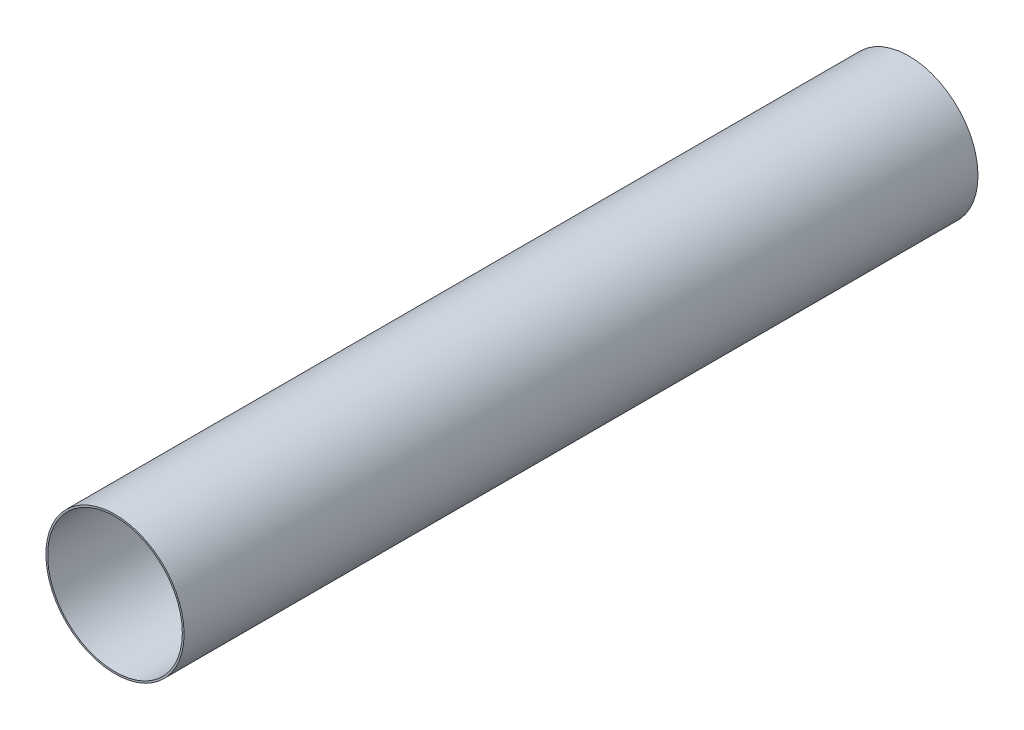
ISO-10303-21;
HEADER;
FILE_DESCRIPTION(('STEP AP214'),'2;1');
FILE_NAME('part.step','',(''),(''),'','','');
FILE_SCHEMA(('AUTOMOTIVE_DESIGN { 1 0 10303 214 1 1 1 1 }'));
ENDSEC;
DATA;
#1=APPLICATION_CONTEXT('core data for automotive mechanical design processes');
#2=APPLICATION_PROTOCOL_DEFINITION('international standard','automotive_design',2000,#1);
#3=PRODUCT_CONTEXT('',#1,'mechanical');
#4=PRODUCT('Part','Part','',(#3));
#5=PRODUCT_RELATED_PRODUCT_CATEGORY('part','',(#4));
#6=PRODUCT_DEFINITION_FORMATION('','',#4);
#7=PRODUCT_DEFINITION_CONTEXT('part definition',#1,'design');
#8=PRODUCT_DEFINITION('design','',#6,#7);
#9=PRODUCT_DEFINITION_SHAPE('','',#8);
#10=(LENGTH_UNIT() NAMED_UNIT(*) SI_UNIT(.MILLI.,.METRE.));
#11=(NAMED_UNIT(*) PLANE_ANGLE_UNIT() SI_UNIT($,.RADIAN.));
#12=(NAMED_UNIT(*) SI_UNIT($,.STERADIAN.) SOLID_ANGLE_UNIT());
#13=UNCERTAINTY_MEASURE_WITH_UNIT(LENGTH_MEASURE(1.E-05),#10,'distance_accuracy_value','');
#14=(GEOMETRIC_REPRESENTATION_CONTEXT(3) GLOBAL_UNCERTAINTY_ASSIGNED_CONTEXT((#13)) GLOBAL_UNIT_ASSIGNED_CONTEXT((#10,
#11,#12)) REPRESENTATION_CONTEXT('',''));
#15=CARTESIAN_POINT('',(0.,0.,0.));
#16=DIRECTION('',(0.,0.,1.));
#17=DIRECTION('',(1.,0.,0.));
#18=AXIS2_PLACEMENT_3D('',#15,#16,#17);
#19=CARTESIAN_POINT('',(0.,0.,900.));
#20=DIRECTION('',(0.,0.,1.));
#21=DIRECTION('',(1.,0.,0.));
#22=AXIS2_PLACEMENT_3D('',#19,#20,#21);
#23=PLANE('',#22);
#24=CARTESIAN_POINT('',(0.,0.,900.));
#25=DIRECTION('',(0.,0.,1.));
#26=DIRECTION('',(1.,0.,0.));
#27=AXIS2_PLACEMENT_3D('',#24,#25,#26);
#28=CIRCLE('',#27,78.35);
#29=CARTESIAN_POINT('',(78.35,0.,900.));
#30=VERTEX_POINT('',#29);
#31=EDGE_CURVE('E10',#30,#30,#28,.T.);
#32=ORIENTED_EDGE('',*,*,#31,.T.);
#33=EDGE_LOOP('',(#32));
#34=FACE_BOUND('',#33,.T.);
#35=CARTESIAN_POINT('',(0.,0.,900.));
#36=DIRECTION('',(0.,0.,1.));
#37=DIRECTION('',(1.,0.,0.));
#38=AXIS2_PLACEMENT_3D('',#35,#36,#37);
#39=CIRCLE('',#38,76.35);
#40=CARTESIAN_POINT('',(76.35,0.,900.));
#41=VERTEX_POINT('',#40);
#42=EDGE_CURVE('E43',#41,#41,#39,.T.);
#43=ORIENTED_EDGE('',*,*,#42,.F.);
#44=EDGE_LOOP('',(#43));
#45=FACE_BOUND('',#44,.T.);
#46=ADVANCED_FACE('F32',(#34,#45),#23,.T.);
#47=CARTESIAN_POINT('',(0.,0.,0.));
#48=DIRECTION('',(0.,0.,1.));
#49=DIRECTION('',(1.,0.,0.));
#50=AXIS2_PLACEMENT_3D('',#47,#48,#49);
#51=PLANE('',#50);
#52=CARTESIAN_POINT('',(0.,0.,0.));
#53=DIRECTION('',(0.,0.,1.));
#54=DIRECTION('',(1.,0.,0.));
#55=AXIS2_PLACEMENT_3D('',#52,#53,#54);
#56=CIRCLE('',#55,78.35);
#57=CARTESIAN_POINT('',(78.35,0.,0.));
#58=VERTEX_POINT('',#57);
#59=EDGE_CURVE('E36',#58,#58,#56,.T.);
#60=ORIENTED_EDGE('',*,*,#59,.F.);
#61=EDGE_LOOP('',(#60));
#62=FACE_BOUND('',#61,.T.);
#63=CARTESIAN_POINT('',(0.,0.,0.));
#64=DIRECTION('',(0.,0.,1.));
#65=DIRECTION('',(1.,0.,0.));
#66=AXIS2_PLACEMENT_3D('',#63,#64,#65);
#67=CIRCLE('',#66,76.35);
#68=CARTESIAN_POINT('',(76.35,0.,0.));
#69=VERTEX_POINT('',#68);
#70=EDGE_CURVE('E45',#69,#69,#67,.T.);
#71=ORIENTED_EDGE('',*,*,#70,.T.);
#72=EDGE_LOOP('',(#71));
#73=FACE_BOUND('',#72,.T.);
#74=ADVANCED_FACE('F55',(#62,#73),#51,.F.);
#75=CARTESIAN_POINT('',(0.,0.,900.));
#76=DIRECTION('',(0.,0.,-1.));
#77=DIRECTION('',(-1.,0.,0.));
#78=AXIS2_PLACEMENT_3D('',#75,#76,#77);
#79=CYLINDRICAL_SURFACE('',#78,78.35);
#80=ORIENTED_EDGE('',*,*,#31,.F.);
#81=EDGE_LOOP('',(#80));
#82=FACE_BOUND('',#81,.T.);
#83=ORIENTED_EDGE('',*,*,#59,.T.);
#84=EDGE_LOOP('',(#83));
#85=FACE_BOUND('',#84,.T.);
#86=ADVANCED_FACE('F34',(#82,#85),#79,.T.);
#87=CARTESIAN_POINT('',(0.,0.,900.));
#88=DIRECTION('',(0.,0.,-1.));
#89=DIRECTION('',(-1.,0.,0.));
#90=AXIS2_PLACEMENT_3D('',#87,#88,#89);
#91=CYLINDRICAL_SURFACE('',#90,76.35);
#92=ORIENTED_EDGE('',*,*,#42,.T.);
#93=EDGE_LOOP('',(#92));
#94=FACE_BOUND('',#93,.T.);
#95=ORIENTED_EDGE('',*,*,#70,.F.);
#96=EDGE_LOOP('',(#95));
#97=FACE_BOUND('',#96,.T.);
#98=ADVANCED_FACE('F51',(#94,#97),#91,.F.);
#99=CLOSED_SHELL('',(#46,#74,#86,#98));
#100=MANIFOLD_SOLID_BREP('B2',#99);
#101=ADVANCED_BREP_SHAPE_REPRESENTATION('',(#18,#100),#14);
#102=SHAPE_DEFINITION_REPRESENTATION(#9,#101);
ENDSEC;
END-ISO-10303-21;
